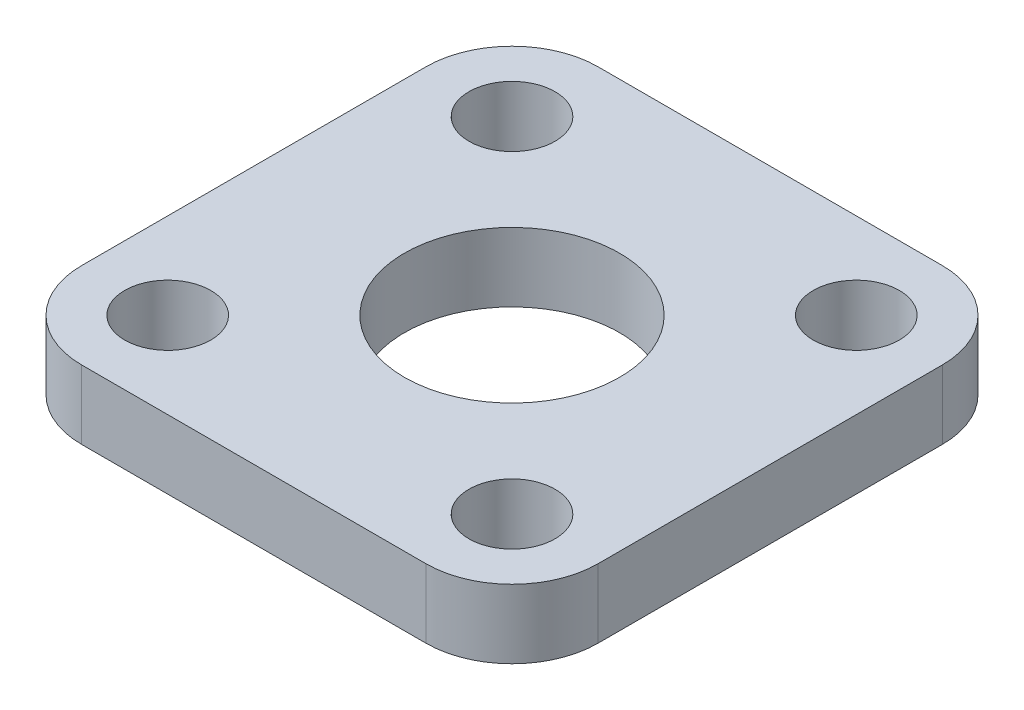
ISO-10303-21;
HEADER;
FILE_DESCRIPTION(('STEP AP214'),'2;1');
FILE_NAME('part.step','',(''),(''),'','','');
FILE_SCHEMA(('AUTOMOTIVE_DESIGN { 1 0 10303 214 1 1 1 1 }'));
ENDSEC;
DATA;
#1=APPLICATION_CONTEXT('core data for automotive mechanical design processes');
#2=APPLICATION_PROTOCOL_DEFINITION('international standard','automotive_design',2000,#1);
#3=PRODUCT_CONTEXT('',#1,'mechanical');
#4=PRODUCT('Part','Part','',(#3));
#5=PRODUCT_RELATED_PRODUCT_CATEGORY('part','',(#4));
#6=PRODUCT_DEFINITION_FORMATION('','',#4);
#7=PRODUCT_DEFINITION_CONTEXT('part definition',#1,'design');
#8=PRODUCT_DEFINITION('design','',#6,#7);
#9=PRODUCT_DEFINITION_SHAPE('','',#8);
#10=(LENGTH_UNIT() NAMED_UNIT(*) SI_UNIT(.MILLI.,.METRE.));
#11=(NAMED_UNIT(*) PLANE_ANGLE_UNIT() SI_UNIT($,.RADIAN.));
#12=(NAMED_UNIT(*) SI_UNIT($,.STERADIAN.) SOLID_ANGLE_UNIT());
#13=UNCERTAINTY_MEASURE_WITH_UNIT(LENGTH_MEASURE(1.E-05),#10,'distance_accuracy_value','');
#14=(GEOMETRIC_REPRESENTATION_CONTEXT(3) GLOBAL_UNCERTAINTY_ASSIGNED_CONTEXT((#13)) GLOBAL_UNIT_ASSIGNED_CONTEXT((#10,
#11,#12)) REPRESENTATION_CONTEXT('',''));
#15=CARTESIAN_POINT('',(0.,0.,0.));
#16=DIRECTION('',(0.,0.,1.));
#17=DIRECTION('',(1.,0.,0.));
#18=AXIS2_PLACEMENT_3D('',#15,#16,#17);
#19=CARTESIAN_POINT('',(0.,2.54,0.));
#20=DIRECTION('',(0.,-1.,0.));
#21=DIRECTION('',(0.,0.,-1.));
#22=AXIS2_PLACEMENT_3D('',#19,#20,#21);
#23=PLANE('',#22);
#24=DIRECTION('',(0.,0.,-1.));
#25=VECTOR('',#24,1.);
#26=CARTESIAN_POINT('',(9.525,2.54,9.525));
#27=LINE('',#26,#25);
#28=CARTESIAN_POINT('',(9.525,2.54,6.35));
#29=VERTEX_POINT('',#28);
#30=CARTESIAN_POINT('',(9.525,2.54,-6.35));
#31=VERTEX_POINT('',#30);
#32=EDGE_CURVE('E136',#29,#31,#27,.T.);
#33=ORIENTED_EDGE('',*,*,#32,.T.);
#34=CARTESIAN_POINT('',(6.35,2.54,-6.35));
#35=DIRECTION('',(0.,-1.,0.));
#36=DIRECTION('',(0.,0.,-1.));
#37=AXIS2_PLACEMENT_3D('',#34,#35,#36);
#38=CIRCLE('',#37,3.175);
#39=CARTESIAN_POINT('',(6.34999999999999,2.54,-9.525));
#40=VERTEX_POINT('',#39);
#41=EDGE_CURVE('E151',#31,#40,#38,.F.);
#42=ORIENTED_EDGE('',*,*,#41,.T.);
#43=DIRECTION('',(-1.,0.,0.));
#44=VECTOR('',#43,1.);
#45=CARTESIAN_POINT('',(-9.525,2.54,-9.525));
#46=LINE('',#45,#44);
#47=CARTESIAN_POINT('',(-6.35,2.54,-9.525));
#48=VERTEX_POINT('',#47);
#49=EDGE_CURVE('E118',#40,#48,#46,.T.);
#50=ORIENTED_EDGE('',*,*,#49,.T.);
#51=CARTESIAN_POINT('',(-6.35,2.54,-6.35));
#52=DIRECTION('',(0.,-1.,0.));
#53=DIRECTION('',(0.,0.,-1.));
#54=AXIS2_PLACEMENT_3D('',#51,#52,#53);
#55=CIRCLE('',#54,3.175);
#56=CARTESIAN_POINT('',(-9.525,2.54,-6.34999999999999));
#57=VERTEX_POINT('',#56);
#58=EDGE_CURVE('E149',#48,#57,#55,.F.);
#59=ORIENTED_EDGE('',*,*,#58,.T.);
#60=DIRECTION('',(0.,0.,1.));
#61=VECTOR('',#60,1.);
#62=CARTESIAN_POINT('',(-9.525,2.54,9.525));
#63=LINE('',#62,#61);
#64=CARTESIAN_POINT('',(-9.525,2.54,6.35));
#65=VERTEX_POINT('',#64);
#66=EDGE_CURVE('E171',#57,#65,#63,.T.);
#67=ORIENTED_EDGE('',*,*,#66,.T.);
#68=CARTESIAN_POINT('',(-6.35,2.54,6.35));
#69=DIRECTION('',(0.,-1.,0.));
#70=DIRECTION('',(0.,0.,-1.));
#71=AXIS2_PLACEMENT_3D('',#68,#69,#70);
#72=CIRCLE('',#71,3.175);
#73=CARTESIAN_POINT('',(-6.35,2.54,9.525));
#74=VERTEX_POINT('',#73);
#75=EDGE_CURVE('E53',#65,#74,#72,.F.);
#76=ORIENTED_EDGE('',*,*,#75,.T.);
#77=DIRECTION('',(1.,0.,0.));
#78=VECTOR('',#77,1.);
#79=CARTESIAN_POINT('',(-9.525,2.54,9.525));
#80=LINE('',#79,#78);
#81=CARTESIAN_POINT('',(6.34999999999999,2.54,9.525));
#82=VERTEX_POINT('',#81);
#83=EDGE_CURVE('E137',#74,#82,#80,.T.);
#84=ORIENTED_EDGE('',*,*,#83,.T.);
#85=CARTESIAN_POINT('',(6.35,2.54,6.35));
#86=DIRECTION('',(0.,-1.,0.));
#87=DIRECTION('',(0.,0.,-1.));
#88=AXIS2_PLACEMENT_3D('',#85,#86,#87);
#89=CIRCLE('',#88,3.175);
#90=EDGE_CURVE('E147',#82,#29,#89,.F.);
#91=ORIENTED_EDGE('',*,*,#90,.T.);
#92=EDGE_LOOP('',(#33,#42,#50,#59,#67,#76,#84,#91));
#93=FACE_BOUND('',#92,.T.);
#94=CARTESIAN_POINT('',(-6.35,2.54,-6.35));
#95=DIRECTION('',(0.,1.,0.));
#96=DIRECTION('',(0.,0.,1.));
#97=AXIS2_PLACEMENT_3D('',#94,#95,#96);
#98=CIRCLE('',#97,1.5875);
#99=CARTESIAN_POINT('',(-6.35,2.54,-4.7625));
#100=VERTEX_POINT('',#99);
#101=EDGE_CURVE('E131',#100,#100,#98,.T.);
#102=ORIENTED_EDGE('',*,*,#101,.F.);
#103=EDGE_LOOP('',(#102));
#104=FACE_BOUND('',#103,.T.);
#105=CARTESIAN_POINT('',(6.35,2.54,-6.35));
#106=DIRECTION('',(0.,1.,0.));
#107=DIRECTION('',(0.,0.,1.));
#108=AXIS2_PLACEMENT_3D('',#105,#106,#107);
#109=CIRCLE('',#108,1.5875);
#110=CARTESIAN_POINT('',(6.35,2.54,-4.7625));
#111=VERTEX_POINT('',#110);
#112=EDGE_CURVE('E186',#111,#111,#109,.T.);
#113=ORIENTED_EDGE('',*,*,#112,.F.);
#114=EDGE_LOOP('',(#113));
#115=FACE_BOUND('',#114,.T.);
#116=CARTESIAN_POINT('',(6.35,2.54,6.35));
#117=DIRECTION('',(0.,1.,0.));
#118=DIRECTION('',(0.,0.,1.));
#119=AXIS2_PLACEMENT_3D('',#116,#117,#118);
#120=CIRCLE('',#119,1.5875);
#121=CARTESIAN_POINT('',(6.35,2.54,7.9375));
#122=VERTEX_POINT('',#121);
#123=EDGE_CURVE('E190',#122,#122,#120,.T.);
#124=ORIENTED_EDGE('',*,*,#123,.F.);
#125=EDGE_LOOP('',(#124));
#126=FACE_BOUND('',#125,.T.);
#127=CARTESIAN_POINT('',(-6.35,2.54,6.35));
#128=DIRECTION('',(0.,1.,0.));
#129=DIRECTION('',(0.,0.,1.));
#130=AXIS2_PLACEMENT_3D('',#127,#128,#129);
#131=CIRCLE('',#130,1.5875);
#132=CARTESIAN_POINT('',(-6.35,2.54,7.9375));
#133=VERTEX_POINT('',#132);
#134=EDGE_CURVE('E194',#133,#133,#131,.T.);
#135=ORIENTED_EDGE('',*,*,#134,.F.);
#136=EDGE_LOOP('',(#135));
#137=FACE_BOUND('',#136,.T.);
#138=CARTESIAN_POINT('',(0.,2.54,0.));
#139=DIRECTION('',(0.,1.,0.));
#140=DIRECTION('',(0.,0.,1.));
#141=AXIS2_PLACEMENT_3D('',#138,#139,#140);
#142=CIRCLE('',#141,3.96875);
#143=CARTESIAN_POINT('',(0.,2.54,3.96875));
#144=VERTEX_POINT('',#143);
#145=EDGE_CURVE('E197',#144,#144,#142,.T.);
#146=ORIENTED_EDGE('',*,*,#145,.F.);
#147=EDGE_LOOP('',(#146));
#148=FACE_BOUND('',#147,.T.);
#149=ADVANCED_FACE('F33',(#93,#104,#115,#126,#137,#148),#23,.F.);
#150=CARTESIAN_POINT('',(0.,0.,0.));
#151=DIRECTION('',(0.,-1.,0.));
#152=DIRECTION('',(0.,0.,-1.));
#153=AXIS2_PLACEMENT_3D('',#150,#151,#152);
#154=PLANE('',#153);
#155=CARTESIAN_POINT('',(-6.35,0.,6.35));
#156=DIRECTION('',(0.,1.,0.));
#157=DIRECTION('',(0.,0.,1.));
#158=AXIS2_PLACEMENT_3D('',#155,#156,#157);
#159=CIRCLE('',#158,1.5875);
#160=CARTESIAN_POINT('',(-6.35,0.,7.9375));
#161=VERTEX_POINT('',#160);
#162=EDGE_CURVE('E199',#161,#161,#159,.T.);
#163=ORIENTED_EDGE('',*,*,#162,.T.);
#164=EDGE_LOOP('',(#163));
#165=FACE_BOUND('',#164,.T.);
#166=CARTESIAN_POINT('',(6.35,0.,-6.35));
#167=DIRECTION('',(0.,1.,0.));
#168=DIRECTION('',(0.,0.,1.));
#169=AXIS2_PLACEMENT_3D('',#166,#167,#168);
#170=CIRCLE('',#169,1.5875);
#171=CARTESIAN_POINT('',(6.35,0.,-4.7625));
#172=VERTEX_POINT('',#171);
#173=EDGE_CURVE('E210',#172,#172,#170,.T.);
#174=ORIENTED_EDGE('',*,*,#173,.T.);
#175=EDGE_LOOP('',(#174));
#176=FACE_BOUND('',#175,.T.);
#177=DIRECTION('',(-1.,0.,0.));
#178=VECTOR('',#177,1.);
#179=CARTESIAN_POINT('',(-9.525,0.,-9.525));
#180=LINE('',#179,#178);
#181=CARTESIAN_POINT('',(6.34999999999999,0.,-9.525));
#182=VERTEX_POINT('',#181);
#183=CARTESIAN_POINT('',(-6.35,0.,-9.525));
#184=VERTEX_POINT('',#183);
#185=EDGE_CURVE('E115',#182,#184,#180,.T.);
#186=ORIENTED_EDGE('',*,*,#185,.F.);
#187=CARTESIAN_POINT('',(6.35,0.,-6.35));
#188=DIRECTION('',(0.,-1.,0.));
#189=DIRECTION('',(0.,0.,-1.));
#190=AXIS2_PLACEMENT_3D('',#187,#188,#189);
#191=CIRCLE('',#190,3.175);
#192=CARTESIAN_POINT('',(9.525,0.,-6.35));
#193=VERTEX_POINT('',#192);
#194=EDGE_CURVE('E98',#182,#193,#191,.T.);
#195=ORIENTED_EDGE('',*,*,#194,.T.);
#196=DIRECTION('',(0.,0.,-1.));
#197=VECTOR('',#196,1.);
#198=CARTESIAN_POINT('',(9.525,0.,9.525));
#199=LINE('',#198,#197);
#200=CARTESIAN_POINT('',(9.525,0.,6.35));
#201=VERTEX_POINT('',#200);
#202=EDGE_CURVE('E126',#201,#193,#199,.T.);
#203=ORIENTED_EDGE('',*,*,#202,.F.);
#204=CARTESIAN_POINT('',(6.35,0.,6.35));
#205=DIRECTION('',(0.,-1.,0.));
#206=DIRECTION('',(0.,0.,-1.));
#207=AXIS2_PLACEMENT_3D('',#204,#205,#206);
#208=CIRCLE('',#207,3.175);
#209=CARTESIAN_POINT('',(6.34999999999999,0.,9.525));
#210=VERTEX_POINT('',#209);
#211=EDGE_CURVE('E140',#201,#210,#208,.T.);
#212=ORIENTED_EDGE('',*,*,#211,.T.);
#213=DIRECTION('',(1.,0.,0.));
#214=VECTOR('',#213,1.);
#215=CARTESIAN_POINT('',(-9.525,0.,9.525));
#216=LINE('',#215,#214);
#217=CARTESIAN_POINT('',(-6.35,0.,9.525));
#218=VERTEX_POINT('',#217);
#219=EDGE_CURVE('E129',#218,#210,#216,.T.);
#220=ORIENTED_EDGE('',*,*,#219,.F.);
#221=CARTESIAN_POINT('',(-6.35,0.,6.35));
#222=DIRECTION('',(0.,-1.,0.));
#223=DIRECTION('',(0.,0.,-1.));
#224=AXIS2_PLACEMENT_3D('',#221,#222,#223);
#225=CIRCLE('',#224,3.175);
#226=CARTESIAN_POINT('',(-9.525,0.,6.35));
#227=VERTEX_POINT('',#226);
#228=EDGE_CURVE('E119',#218,#227,#225,.T.);
#229=ORIENTED_EDGE('',*,*,#228,.T.);
#230=DIRECTION('',(0.,0.,1.));
#231=VECTOR('',#230,1.);
#232=CARTESIAN_POINT('',(-9.525,0.,9.525));
#233=LINE('',#232,#231);
#234=CARTESIAN_POINT('',(-9.525,0.,-6.34999999999999));
#235=VERTEX_POINT('',#234);
#236=EDGE_CURVE('E125',#235,#227,#233,.T.);
#237=ORIENTED_EDGE('',*,*,#236,.F.);
#238=CARTESIAN_POINT('',(-6.35,0.,-6.35));
#239=DIRECTION('',(0.,-1.,0.));
#240=DIRECTION('',(0.,0.,-1.));
#241=AXIS2_PLACEMENT_3D('',#238,#239,#240);
#242=CIRCLE('',#241,3.175);
#243=EDGE_CURVE('E109',#235,#184,#242,.T.);
#244=ORIENTED_EDGE('',*,*,#243,.T.);
#245=EDGE_LOOP('',(#186,#195,#203,#212,#220,#229,#237,#244));
#246=FACE_BOUND('',#245,.T.);
#247=CARTESIAN_POINT('',(-6.35,0.,-6.35));
#248=DIRECTION('',(0.,1.,0.));
#249=DIRECTION('',(0.,0.,1.));
#250=AXIS2_PLACEMENT_3D('',#247,#248,#249);
#251=CIRCLE('',#250,1.5875);
#252=CARTESIAN_POINT('',(-6.35,0.,-4.7625));
#253=VERTEX_POINT('',#252);
#254=EDGE_CURVE('E174',#253,#253,#251,.T.);
#255=ORIENTED_EDGE('',*,*,#254,.T.);
#256=EDGE_LOOP('',(#255));
#257=FACE_BOUND('',#256,.T.);
#258=CARTESIAN_POINT('',(6.35,0.,6.35));
#259=DIRECTION('',(0.,1.,0.));
#260=DIRECTION('',(0.,0.,1.));
#261=AXIS2_PLACEMENT_3D('',#258,#259,#260);
#262=CIRCLE('',#261,1.5875);
#263=CARTESIAN_POINT('',(6.35,0.,7.9375));
#264=VERTEX_POINT('',#263);
#265=EDGE_CURVE('E207',#264,#264,#262,.T.);
#266=ORIENTED_EDGE('',*,*,#265,.T.);
#267=EDGE_LOOP('',(#266));
#268=FACE_BOUND('',#267,.T.);
#269=CARTESIAN_POINT('',(0.,0.,0.));
#270=DIRECTION('',(0.,1.,0.));
#271=DIRECTION('',(0.,0.,1.));
#272=AXIS2_PLACEMENT_3D('',#269,#270,#271);
#273=CIRCLE('',#272,3.96875);
#274=CARTESIAN_POINT('',(0.,0.,3.96875));
#275=VERTEX_POINT('',#274);
#276=EDGE_CURVE('E200',#275,#275,#273,.T.);
#277=ORIENTED_EDGE('',*,*,#276,.T.);
#278=EDGE_LOOP('',(#277));
#279=FACE_BOUND('',#278,.T.);
#280=ADVANCED_FACE('F122',(#165,#176,#246,#257,#268,#279),#154,.T.);
#281=CARTESIAN_POINT('',(9.525,2.54,9.525));
#282=DIRECTION('',(-1.,0.,0.));
#283=DIRECTION('',(0.,0.,1.));
#284=AXIS2_PLACEMENT_3D('',#281,#282,#283);
#285=PLANE('',#284);
#286=ORIENTED_EDGE('',*,*,#202,.T.);
#287=DIRECTION('',(0.,-1.,0.));
#288=VECTOR('',#287,1.);
#289=CARTESIAN_POINT('',(9.525,2.54,-6.35));
#290=LINE('',#289,#288);
#291=EDGE_CURVE('E103',#193,#31,#290,.F.);
#292=ORIENTED_EDGE('',*,*,#291,.T.);
#293=ORIENTED_EDGE('',*,*,#32,.F.);
#294=DIRECTION('',(0.,-1.,0.));
#295=VECTOR('',#294,1.);
#296=CARTESIAN_POINT('',(9.525,2.54,6.35));
#297=LINE('',#296,#295);
#298=EDGE_CURVE('E108',#29,#201,#297,.T.);
#299=ORIENTED_EDGE('',*,*,#298,.T.);
#300=EDGE_LOOP('',(#286,#292,#293,#299));
#301=FACE_BOUND('',#300,.T.);
#302=ADVANCED_FACE('F168',(#301),#285,.F.);
#303=CARTESIAN_POINT('',(-9.525,2.54,-9.525));
#304=DIRECTION('',(0.,0.,1.));
#305=DIRECTION('',(1.,0.,0.));
#306=AXIS2_PLACEMENT_3D('',#303,#304,#305);
#307=PLANE('',#306);
#308=ORIENTED_EDGE('',*,*,#49,.F.);
#309=DIRECTION('',(0.,-1.,0.));
#310=VECTOR('',#309,1.);
#311=CARTESIAN_POINT('',(6.35,2.54,-9.525));
#312=LINE('',#311,#310);
#313=EDGE_CURVE('E102',#40,#182,#312,.T.);
#314=ORIENTED_EDGE('',*,*,#313,.T.);
#315=ORIENTED_EDGE('',*,*,#185,.T.);
#316=DIRECTION('',(0.,-1.,0.));
#317=VECTOR('',#316,1.);
#318=CARTESIAN_POINT('',(-6.35,2.54,-9.525));
#319=LINE('',#318,#317);
#320=EDGE_CURVE('E120',#184,#48,#319,.F.);
#321=ORIENTED_EDGE('',*,*,#320,.T.);
#322=EDGE_LOOP('',(#308,#314,#315,#321));
#323=FACE_BOUND('',#322,.T.);
#324=ADVANCED_FACE('F114',(#323),#307,.F.);
#325=CARTESIAN_POINT('',(-9.525,2.54,9.525));
#326=DIRECTION('',(1.,0.,0.));
#327=DIRECTION('',(0.,0.,-1.));
#328=AXIS2_PLACEMENT_3D('',#325,#326,#327);
#329=PLANE('',#328);
#330=ORIENTED_EDGE('',*,*,#66,.F.);
#331=DIRECTION('',(0.,-1.,0.));
#332=VECTOR('',#331,1.);
#333=CARTESIAN_POINT('',(-9.525,2.54,-6.35));
#334=LINE('',#333,#332);
#335=EDGE_CURVE('E155',#57,#235,#334,.T.);
#336=ORIENTED_EDGE('',*,*,#335,.T.);
#337=ORIENTED_EDGE('',*,*,#236,.T.);
#338=DIRECTION('',(0.,-1.,0.));
#339=VECTOR('',#338,1.);
#340=CARTESIAN_POINT('',(-9.525,2.54,6.35));
#341=LINE('',#340,#339);
#342=EDGE_CURVE('E153',#227,#65,#341,.F.);
#343=ORIENTED_EDGE('',*,*,#342,.T.);
#344=EDGE_LOOP('',(#330,#336,#337,#343));
#345=FACE_BOUND('',#344,.T.);
#346=ADVANCED_FACE('F231',(#345),#329,.F.);
#347=CARTESIAN_POINT('',(-9.525,2.54,9.525));
#348=DIRECTION('',(0.,0.,-1.));
#349=DIRECTION('',(-1.,0.,0.));
#350=AXIS2_PLACEMENT_3D('',#347,#348,#349);
#351=PLANE('',#350);
#352=ORIENTED_EDGE('',*,*,#219,.T.);
#353=DIRECTION('',(0.,-1.,0.));
#354=VECTOR('',#353,1.);
#355=CARTESIAN_POINT('',(6.35,2.54,9.525));
#356=LINE('',#355,#354);
#357=EDGE_CURVE('E11',#210,#82,#356,.F.);
#358=ORIENTED_EDGE('',*,*,#357,.T.);
#359=ORIENTED_EDGE('',*,*,#83,.F.);
#360=DIRECTION('',(0.,-1.,0.));
#361=VECTOR('',#360,1.);
#362=CARTESIAN_POINT('',(-6.35,2.54,9.525));
#363=LINE('',#362,#361);
#364=EDGE_CURVE('E41',#74,#218,#363,.T.);
#365=ORIENTED_EDGE('',*,*,#364,.T.);
#366=EDGE_LOOP('',(#352,#358,#359,#365));
#367=FACE_BOUND('',#366,.T.);
#368=ADVANCED_FACE('F160',(#367),#351,.F.);
#369=CARTESIAN_POINT('',(-6.35,2.54,-6.35));
#370=DIRECTION('',(0.,-1.,0.));
#371=DIRECTION('',(0.,0.,-1.));
#372=AXIS2_PLACEMENT_3D('',#369,#370,#371);
#373=CYLINDRICAL_SURFACE('',#372,1.5875);
#374=ORIENTED_EDGE('',*,*,#101,.T.);
#375=EDGE_LOOP('',(#374));
#376=FACE_BOUND('',#375,.T.);
#377=ORIENTED_EDGE('',*,*,#254,.F.);
#378=EDGE_LOOP('',(#377));
#379=FACE_BOUND('',#378,.T.);
#380=ADVANCED_FACE('F220',(#376,#379),#373,.F.);
#381=CARTESIAN_POINT('',(6.35,2.54,-6.35));
#382=DIRECTION('',(0.,-1.,0.));
#383=DIRECTION('',(0.,0.,-1.));
#384=AXIS2_PLACEMENT_3D('',#381,#382,#383);
#385=CYLINDRICAL_SURFACE('',#384,1.5875);
#386=ORIENTED_EDGE('',*,*,#112,.T.);
#387=EDGE_LOOP('',(#386));
#388=FACE_BOUND('',#387,.T.);
#389=ORIENTED_EDGE('',*,*,#173,.F.);
#390=EDGE_LOOP('',(#389));
#391=FACE_BOUND('',#390,.T.);
#392=ADVANCED_FACE('F222',(#388,#391),#385,.F.);
#393=CARTESIAN_POINT('',(6.35,2.54,6.35));
#394=DIRECTION('',(0.,-1.,0.));
#395=DIRECTION('',(0.,0.,-1.));
#396=AXIS2_PLACEMENT_3D('',#393,#394,#395);
#397=CYLINDRICAL_SURFACE('',#396,1.5875);
#398=ORIENTED_EDGE('',*,*,#123,.T.);
#399=EDGE_LOOP('',(#398));
#400=FACE_BOUND('',#399,.T.);
#401=ORIENTED_EDGE('',*,*,#265,.F.);
#402=EDGE_LOOP('',(#401));
#403=FACE_BOUND('',#402,.T.);
#404=ADVANCED_FACE('F228',(#400,#403),#397,.F.);
#405=CARTESIAN_POINT('',(-6.35,2.54,6.35));
#406=DIRECTION('',(0.,-1.,0.));
#407=DIRECTION('',(0.,0.,-1.));
#408=AXIS2_PLACEMENT_3D('',#405,#406,#407);
#409=CYLINDRICAL_SURFACE('',#408,1.5875);
#410=ORIENTED_EDGE('',*,*,#134,.T.);
#411=EDGE_LOOP('',(#410));
#412=FACE_BOUND('',#411,.T.);
#413=ORIENTED_EDGE('',*,*,#162,.F.);
#414=EDGE_LOOP('',(#413));
#415=FACE_BOUND('',#414,.T.);
#416=ADVANCED_FACE('F323',(#412,#415),#409,.F.);
#417=CARTESIAN_POINT('',(0.,2.54,0.));
#418=DIRECTION('',(0.,-1.,0.));
#419=DIRECTION('',(0.,0.,-1.));
#420=AXIS2_PLACEMENT_3D('',#417,#418,#419);
#421=CYLINDRICAL_SURFACE('',#420,3.96875);
#422=ORIENTED_EDGE('',*,*,#145,.T.);
#423=EDGE_LOOP('',(#422));
#424=FACE_BOUND('',#423,.T.);
#425=ORIENTED_EDGE('',*,*,#276,.F.);
#426=EDGE_LOOP('',(#425));
#427=FACE_BOUND('',#426,.T.);
#428=ADVANCED_FACE('F248',(#424,#427),#421,.F.);
#429=CARTESIAN_POINT('',(6.35,2.54,-6.35));
#430=DIRECTION('',(0.,-1.,0.));
#431=DIRECTION('',(0.,0.,-1.));
#432=AXIS2_PLACEMENT_3D('',#429,#430,#431);
#433=CYLINDRICAL_SURFACE('',#432,3.175);
#434=ORIENTED_EDGE('',*,*,#41,.F.);
#435=ORIENTED_EDGE('',*,*,#291,.F.);
#436=ORIENTED_EDGE('',*,*,#194,.F.);
#437=ORIENTED_EDGE('',*,*,#313,.F.);
#438=EDGE_LOOP('',(#434,#435,#436,#437));
#439=FACE_BOUND('',#438,.T.);
#440=ADVANCED_FACE('F101',(#439),#433,.T.);
#441=CARTESIAN_POINT('',(-6.35,2.54,-6.35));
#442=DIRECTION('',(0.,-1.,0.));
#443=DIRECTION('',(0.,0.,-1.));
#444=AXIS2_PLACEMENT_3D('',#441,#442,#443);
#445=CYLINDRICAL_SURFACE('',#444,3.175);
#446=ORIENTED_EDGE('',*,*,#58,.F.);
#447=ORIENTED_EDGE('',*,*,#320,.F.);
#448=ORIENTED_EDGE('',*,*,#243,.F.);
#449=ORIENTED_EDGE('',*,*,#335,.F.);
#450=EDGE_LOOP('',(#446,#447,#448,#449));
#451=FACE_BOUND('',#450,.T.);
#452=ADVANCED_FACE('F247',(#451),#445,.T.);
#453=CARTESIAN_POINT('',(6.35,2.54,6.35));
#454=DIRECTION('',(0.,-1.,0.));
#455=DIRECTION('',(0.,0.,-1.));
#456=AXIS2_PLACEMENT_3D('',#453,#454,#455);
#457=CYLINDRICAL_SURFACE('',#456,3.175);
#458=ORIENTED_EDGE('',*,*,#90,.F.);
#459=ORIENTED_EDGE('',*,*,#357,.F.);
#460=ORIENTED_EDGE('',*,*,#211,.F.);
#461=ORIENTED_EDGE('',*,*,#298,.F.);
#462=EDGE_LOOP('',(#458,#459,#460,#461));
#463=FACE_BOUND('',#462,.T.);
#464=ADVANCED_FACE('F165',(#463),#457,.T.);
#465=CARTESIAN_POINT('',(-6.35,2.54,6.35));
#466=DIRECTION('',(0.,-1.,0.));
#467=DIRECTION('',(0.,0.,-1.));
#468=AXIS2_PLACEMENT_3D('',#465,#466,#467);
#469=CYLINDRICAL_SURFACE('',#468,3.175);
#470=ORIENTED_EDGE('',*,*,#75,.F.);
#471=ORIENTED_EDGE('',*,*,#342,.F.);
#472=ORIENTED_EDGE('',*,*,#228,.F.);
#473=ORIENTED_EDGE('',*,*,#364,.F.);
#474=EDGE_LOOP('',(#470,#471,#472,#473));
#475=FACE_BOUND('',#474,.T.);
#476=ADVANCED_FACE('F35',(#475),#469,.T.);
#477=CLOSED_SHELL('',(#149,#280,#302,#324,#346,#368,#380,#392,#404,#416,#428,#440,#452,#464,#476));
#478=MANIFOLD_SOLID_BREP('B2',#477);
#479=ADVANCED_BREP_SHAPE_REPRESENTATION('',(#18,#478),#14);
#480=SHAPE_DEFINITION_REPRESENTATION(#9,#479);
ENDSEC;
END-ISO-10303-21;
